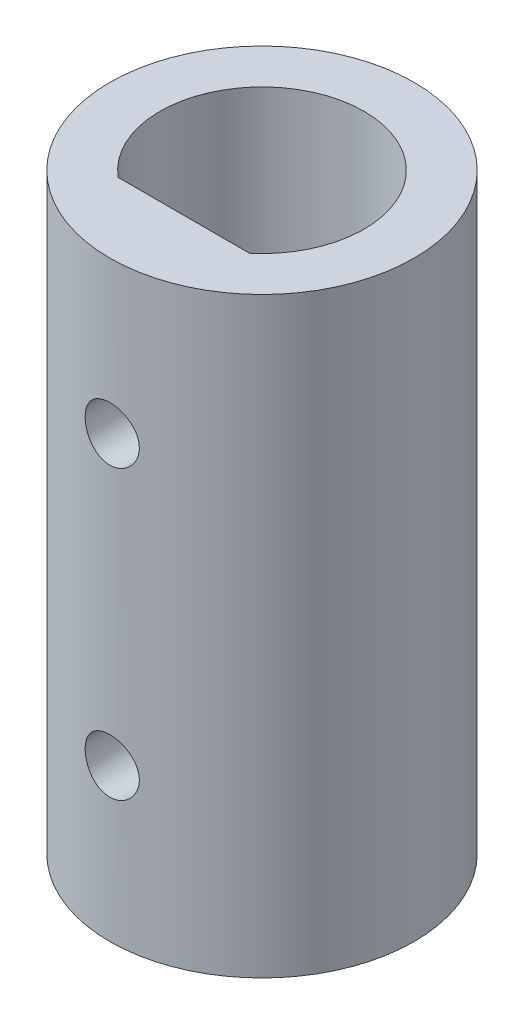
ISO-10303-21;
HEADER;
FILE_DESCRIPTION(('STEP AP214'),'2;1');
FILE_NAME('part.step','',(''),(''),'','','');
FILE_SCHEMA(('AUTOMOTIVE_DESIGN { 1 0 10303 214 1 1 1 1 }'));
ENDSEC;
DATA;
#1=APPLICATION_CONTEXT('core data for automotive mechanical design processes');
#2=APPLICATION_PROTOCOL_DEFINITION('international standard','automotive_design',2000,#1);
#3=PRODUCT_CONTEXT('',#1,'mechanical');
#4=PRODUCT('Part','Part','',(#3));
#5=PRODUCT_RELATED_PRODUCT_CATEGORY('part','',(#4));
#6=PRODUCT_DEFINITION_FORMATION('','',#4);
#7=PRODUCT_DEFINITION_CONTEXT('part definition',#1,'design');
#8=PRODUCT_DEFINITION('design','',#6,#7);
#9=PRODUCT_DEFINITION_SHAPE('','',#8);
#10=(LENGTH_UNIT() NAMED_UNIT(*) SI_UNIT(.MILLI.,.METRE.));
#11=(NAMED_UNIT(*) PLANE_ANGLE_UNIT() SI_UNIT($,.RADIAN.));
#12=(NAMED_UNIT(*) SI_UNIT($,.STERADIAN.) SOLID_ANGLE_UNIT());
#13=UNCERTAINTY_MEASURE_WITH_UNIT(LENGTH_MEASURE(1.E-05),#10,'distance_accuracy_value','');
#14=(GEOMETRIC_REPRESENTATION_CONTEXT(3) GLOBAL_UNCERTAINTY_ASSIGNED_CONTEXT((#13)) GLOBAL_UNIT_ASSIGNED_CONTEXT((#10,
#11,#12)) REPRESENTATION_CONTEXT('',''));
#15=CARTESIAN_POINT('',(0.,0.,0.));
#16=DIRECTION('',(0.,0.,1.));
#17=DIRECTION('',(1.,0.,0.));
#18=AXIS2_PLACEMENT_3D('',#15,#16,#17);
#19=CARTESIAN_POINT('',(0.,24.7,0.));
#20=DIRECTION('',(0.,1.,0.));
#21=DIRECTION('',(0.,0.,1.));
#22=AXIS2_PLACEMENT_3D('',#19,#20,#21);
#23=PLANE('',#22);
#24=CARTESIAN_POINT('',(0.,24.7,0.));
#25=DIRECTION('',(0.,1.,0.));
#26=DIRECTION('',(0.,0.,1.));
#27=AXIS2_PLACEMENT_3D('',#24,#25,#26);
#28=CIRCLE('',#27,6.35);
#29=CARTESIAN_POINT('',(0.,24.7,6.35));
#30=VERTEX_POINT('',#29);
#31=EDGE_CURVE('E11',#30,#30,#28,.T.);
#32=ORIENTED_EDGE('',*,*,#31,.T.);
#33=EDGE_LOOP('',(#32));
#34=FACE_BOUND('',#33,.T.);
#35=DIRECTION('',(1.,0.,0.));
#36=VECTOR('',#35,1.);
#37=CARTESIAN_POINT('',(-2.74238320566813,24.7,3.26033282336529));
#38=LINE('',#37,#36);
#39=CARTESIAN_POINT('',(-2.74238320566813,24.7,3.26033282336529));
#40=VERTEX_POINT('',#39);
#41=CARTESIAN_POINT('',(2.74238320566813,24.7,3.26033282336529));
#42=VERTEX_POINT('',#41);
#43=EDGE_CURVE('E91',#40,#42,#38,.T.);
#44=ORIENTED_EDGE('',*,*,#43,.F.);
#45=CARTESIAN_POINT('',(0.,24.7,0.));
#46=DIRECTION('',(0.,1.,0.));
#47=DIRECTION('',(0.,0.,1.));
#48=AXIS2_PLACEMENT_3D('',#45,#46,#47);
#49=CIRCLE('',#48,4.26033282336529);
#50=EDGE_CURVE('E75',#42,#40,#49,.T.);
#51=ORIENTED_EDGE('',*,*,#50,.F.);
#52=EDGE_LOOP('',(#44,#51));
#53=FACE_BOUND('',#52,.T.);
#54=ADVANCED_FACE('F40',(#34,#53),#23,.T.);
#55=CARTESIAN_POINT('',(0.,0.,0.));
#56=DIRECTION('',(0.,1.,0.));
#57=DIRECTION('',(0.,0.,1.));
#58=AXIS2_PLACEMENT_3D('',#55,#56,#57);
#59=PLANE('',#58);
#60=CARTESIAN_POINT('',(0.,0.,0.));
#61=DIRECTION('',(0.,1.,0.));
#62=DIRECTION('',(0.,0.,1.));
#63=AXIS2_PLACEMENT_3D('',#60,#61,#62);
#64=CIRCLE('',#63,6.35);
#65=CARTESIAN_POINT('',(0.,0.,6.35));
#66=VERTEX_POINT('',#65);
#67=EDGE_CURVE('E45',#66,#66,#64,.T.);
#68=ORIENTED_EDGE('',*,*,#67,.F.);
#69=EDGE_LOOP('',(#68));
#70=FACE_BOUND('',#69,.T.);
#71=CARTESIAN_POINT('',(0.,0.,0.));
#72=DIRECTION('',(0.,1.,0.));
#73=DIRECTION('',(0.,0.,1.));
#74=AXIS2_PLACEMENT_3D('',#71,#72,#73);
#75=CIRCLE('',#74,4.26033282336529);
#76=CARTESIAN_POINT('',(2.74238320566813,0.,3.26033282336529));
#77=VERTEX_POINT('',#76);
#78=CARTESIAN_POINT('',(-2.74238320566813,0.,3.26033282336529));
#79=VERTEX_POINT('',#78);
#80=EDGE_CURVE('E64',#77,#79,#75,.T.);
#81=ORIENTED_EDGE('',*,*,#80,.T.);
#82=DIRECTION('',(1.,0.,0.));
#83=VECTOR('',#82,1.);
#84=CARTESIAN_POINT('',(-2.74238320566813,0.,3.26033282336529));
#85=LINE('',#84,#83);
#86=EDGE_CURVE('E70',#79,#77,#85,.T.);
#87=ORIENTED_EDGE('',*,*,#86,.T.);
#88=EDGE_LOOP('',(#81,#87));
#89=FACE_BOUND('',#88,.T.);
#90=ADVANCED_FACE('F82',(#70,#89),#59,.F.);
#91=CARTESIAN_POINT('',(0.,24.7,0.));
#92=DIRECTION('',(0.,-1.,0.));
#93=DIRECTION('',(0.,0.,-1.));
#94=AXIS2_PLACEMENT_3D('',#91,#92,#93);
#95=CYLINDRICAL_SURFACE('',#94,6.35);
#96=CARTESIAN_POINT('',(0.,17.22,6.35));
#97=CARTESIAN_POINT('',(-0.0629399577008191,17.2200024637697,6.34999888434963));
#98=CARTESIAN_POINT('',(-0.125912656247927,17.2252763142626,6.34905452477746));
#99=CARTESIAN_POINT('',(-0.250087457676584,17.2462210665218,6.34537826804387));
#100=CARTESIAN_POINT('',(-0.311287953507829,17.261901114493,6.34264479842876));
#101=CARTESIAN_POINT('',(-0.430104209618959,17.3031661781344,6.33569648349699));
#102=CARTESIAN_POINT('',(-0.487723014283772,17.3287426445925,6.33148291707934));
#103=CARTESIAN_POINT('',(-0.597845251075668,17.3890511246943,6.32203602195574));
#104=CARTESIAN_POINT('',(-0.65034917682781,17.4237822536416,6.31680279180169));
#105=CARTESIAN_POINT('',(-0.749326542742328,17.501814115411,6.30583196424201));
#106=CARTESIAN_POINT('',(-0.795736518187857,17.5451947379225,6.30008996521651));
#107=CARTESIAN_POINT('',(-0.880659922550115,17.6391222564569,6.28878190547747));
#108=CARTESIAN_POINT('',(-0.919172817680828,17.6896696365109,6.2832158566784));
#109=CARTESIAN_POINT('',(-0.987468276358079,17.7969384519111,6.27284721499309));
#110=CARTESIAN_POINT('',(-1.01718712579184,17.8537010498348,6.2680503039156));
#111=CARTESIAN_POINT('',(-1.06664321936906,17.9715126375646,6.2598246594552));
#112=CARTESIAN_POINT('',(-1.08638123544489,18.0325612954645,6.25639582026793));
#113=CARTESIAN_POINT('',(-1.11511342949689,18.1565358875388,6.2513386355925));
#114=CARTESIAN_POINT('',(-1.12421777540382,18.2194355221677,6.24969184097199));
#115=CARTESIAN_POINT('',(-1.13176596837167,18.3458895064267,6.24832949681279));
#116=CARTESIAN_POINT('',(-1.13021067573572,18.4094438028079,6.24861379142245));
#117=CARTESIAN_POINT('',(-1.11657326235129,18.5346104523972,6.25106468394744));
#118=CARTESIAN_POINT('',(-1.10461569460633,18.5962368762426,6.25320900966246));
#119=CARTESIAN_POINT('',(-1.07070899066206,18.716594677856,6.25910342730552));
#120=CARTESIAN_POINT('',(-1.04875946832941,18.775325943645,6.26285358128956));
#121=CARTESIAN_POINT('',(-0.995368011244417,18.8885946785177,6.27156075796024));
#122=CARTESIAN_POINT('',(-0.963875111111273,18.9431076076952,6.27652423203582));
#123=CARTESIAN_POINT('',(-0.892326975518068,19.0461223228183,6.28709442722226));
#124=CARTESIAN_POINT('',(-0.852270954816918,19.0946235568445,6.29270120730262));
#125=CARTESIAN_POINT('',(-0.764058733569581,19.1849583861128,6.30402370831999));
#126=CARTESIAN_POINT('',(-0.715795840152014,19.226687813058,6.30973984748415));
#127=CARTESIAN_POINT('',(-0.612898694327184,19.3014726924902,6.3205638240554));
#128=CARTESIAN_POINT('',(-0.558264389488849,19.3345280735903,6.32567165645596));
#129=CARTESIAN_POINT('',(-0.444071695660482,19.3910391002486,6.33471231748266));
#130=CARTESIAN_POINT('',(-0.384508223415678,19.4144846835163,6.33864391333014));
#131=CARTESIAN_POINT('',(-0.262203103564915,19.4510093616679,6.34487943237008));
#132=CARTESIAN_POINT('',(-0.199461760195388,19.4640894469143,6.34718351105993));
#133=CARTESIAN_POINT('',(-0.073478858896347,19.479368628902,6.34988324240335));
#134=CARTESIAN_POINT('',(-0.0102551452022524,19.4817105803859,6.35030394870282));
#135=CARTESIAN_POINT('',(0.115680807166263,19.4758291047197,6.34925846225552));
#136=CARTESIAN_POINT('',(0.17839306826035,19.467606143218,6.34779235267011));
#137=CARTESIAN_POINT('',(0.301078429103724,19.4409470635608,6.3431535233318));
#138=CARTESIAN_POINT('',(0.361067567619185,19.4225824942053,6.33999276379296));
#139=CARTESIAN_POINT('',(0.477115542966495,19.3762383826707,6.33231756519775));
#140=CARTESIAN_POINT('',(0.533174133877712,19.348258239524,6.32780304153415));
#141=CARTESIAN_POINT('',(0.640384525168203,19.2831558696105,6.31785868215815));
#142=CARTESIAN_POINT('',(0.691481941351823,19.2459454325524,6.31242018443781));
#143=CARTESIAN_POINT('',(0.786758391627041,19.1635590330923,6.30125515306999));
#144=CARTESIAN_POINT('',(0.830936847372642,19.1183824054782,6.29552859539679));
#145=CARTESIAN_POINT('',(0.911657891901744,19.0207020682917,6.28435073267801));
#146=CARTESIAN_POINT('',(0.94810343817564,18.9681176217865,6.27890351026718));
#147=CARTESIAN_POINT('',(1.01164397617943,18.857488913359,6.26898037808471));
#148=CARTESIAN_POINT('',(1.03873929277566,18.7994448412162,6.26450443456875));
#149=CARTESIAN_POINT('',(1.08266905763519,18.6798026798861,6.25706202453356));
#150=CARTESIAN_POINT('',(1.09954978675862,18.6182220262732,6.25408875984629));
#151=CARTESIAN_POINT('',(1.12271538156272,18.4930412979424,6.2499720818292));
#152=CARTESIAN_POINT('',(1.12900131160193,18.4294414267301,6.2488284846907));
#153=CARTESIAN_POINT('',(1.13076603971789,18.302998195127,6.24850929319388));
#154=CARTESIAN_POINT('',(1.12639774759767,18.2401569875695,6.24930585339935));
#155=CARTESIAN_POINT('',(1.10731085189081,18.1161194424305,6.25271581916397));
#156=CARTESIAN_POINT('',(1.0925922961175,18.0549230972519,6.25532921633018));
#157=CARTESIAN_POINT('',(1.05328443387377,17.9359837727612,6.26206720107938));
#158=CARTESIAN_POINT('',(1.02871008961607,17.8782357105489,6.26618949715672));
#159=CARTESIAN_POINT('',(0.970404434971474,17.7676575027985,6.27548268489756));
#160=CARTESIAN_POINT('',(0.936672567531126,17.7148276566989,6.28065364034631));
#161=CARTESIAN_POINT('',(0.860471089982826,17.6148164095938,6.29154882500414));
#162=CARTESIAN_POINT('',(0.817889609705644,17.5677209435172,6.29727958408207));
#163=CARTESIAN_POINT('',(0.725432295520826,17.4812922312998,6.30859831056718));
#164=CARTESIAN_POINT('',(0.675554785842124,17.4419607733058,6.31418624482268));
#165=CARTESIAN_POINT('',(0.569445223963215,17.3718856685687,6.32464183033691));
#166=CARTESIAN_POINT('',(0.513165573498392,17.3412131653736,6.32950336839369));
#167=CARTESIAN_POINT('',(0.396186039696229,17.2898064926686,6.33789887797285));
#168=CARTESIAN_POINT('',(0.335490492911398,17.2690627206178,6.34143413148865));
#169=CARTESIAN_POINT('',(0.228823740973171,17.2424523318581,6.34603388241872));
#170=CARTESIAN_POINT('',(0.183486832522365,17.234046663634,6.34751299148448));
#171=CARTESIAN_POINT('',(0.0921057844594946,17.2228196556706,6.34949644812483));
#172=CARTESIAN_POINT('',(0.0460616599398405,17.2199981969273,6.35000081647192));
#173=CARTESIAN_POINT('',(0.,17.22,6.35));
#174=B_SPLINE_CURVE_WITH_KNOTS('',3,(#96,#97,#98,#99,#100,#101,#102,#103,#104,#105,#106,#107,
#108,#109,#110,#111,#112,#113,#114,#115,#116,#117,#118,#119,#120,#121,#122,#123,#124,#125,#126,
#127,#128,#129,#130,#131,#132,#133,#134,#135,#136,#137,#138,#139,#140,#141,#142,#143,#144,#145,
#146,#147,#148,#149,#150,#151,#152,#153,#154,#155,#156,#157,#158,#159,#160,#161,#162,#163,#164,
#165,#166,#167,#168,#169,#170,#171,#172,#173),.UNSPECIFIED.,.T.,.F.,(4,2,2,2,2,2,2,2,2,2,2,2,2,
2,2,2,2,2,2,2,2,2,2,2,2,2,2,2,2,2,2,2,2,2,2,2,2,2,4),(0.,0.188651461907671,0.377468953151042,
0.566123693618805,0.754760209382763,0.945227273032747,1.13570720665005,1.32753518070258,
1.51934831622696,1.70915607127828,1.89894850777233,2.08649923979312,2.27405722021965,
2.46263503412746,2.6512301481088,2.84249646693217,3.03376435981897,3.22523201825415,
3.41668138087569,3.60557626311063,3.7944628200937,3.98203350315197,4.16961591139971,
4.35906512869483,4.54853017333657,4.74024809805132,4.93195936100736,5.12279537318303,
5.31361221273967,5.50170659778937,5.68980011393742,5.87760915701834,6.06542962711112,
6.25578707201862,6.44618830757179,6.63811117978734,6.82984805744879,6.96791273037186,
7.10597446099535),.UNSPECIFIED.);
#175=CARTESIAN_POINT('',(0.,17.22,6.35));
#176=VERTEX_POINT('',#175);
#177=EDGE_CURVE('E84',#176,#176,#174,.T.);
#178=ORIENTED_EDGE('',*,*,#177,.T.);
#179=EDGE_LOOP('',(#178));
#180=FACE_BOUND('',#179,.T.);
#181=CARTESIAN_POINT('',(0.,5.22,6.35));
#182=CARTESIAN_POINT('',(-0.062939957700819,5.22000246376968,6.34999888434963));
#183=CARTESIAN_POINT('',(-0.125912656247927,5.22527631426258,6.34905452477746));
#184=CARTESIAN_POINT('',(-0.250087457676584,5.24622106652184,6.34537826804387));
#185=CARTESIAN_POINT('',(-0.311287953507829,5.26190111449296,6.34264479842876));
#186=CARTESIAN_POINT('',(-0.430104209618959,5.30316617813443,6.33569648349699));
#187=CARTESIAN_POINT('',(-0.487723014283772,5.3287426445925,6.33148291707934));
#188=CARTESIAN_POINT('',(-0.597845251075668,5.38905112469426,6.32203602195574));
#189=CARTESIAN_POINT('',(-0.65034917682781,5.42378225364158,6.31680279180169));
#190=CARTESIAN_POINT('',(-0.749326542742328,5.50181411541102,6.30583196424201));
#191=CARTESIAN_POINT('',(-0.795736518187857,5.54519473792252,6.30008996521651));
#192=CARTESIAN_POINT('',(-0.880659922550115,5.63912225645694,6.28878190547747));
#193=CARTESIAN_POINT('',(-0.919172817680828,5.68966963651094,6.2832158566784));
#194=CARTESIAN_POINT('',(-0.987468276358079,5.79693845191112,6.27284721499309));
#195=CARTESIAN_POINT('',(-1.01718712579184,5.85370104983483,6.2680503039156));
#196=CARTESIAN_POINT('',(-1.06664321936906,5.97151263756463,6.2598246594552));
#197=CARTESIAN_POINT('',(-1.08638123544489,6.0325612954645,6.25639582026793));
#198=CARTESIAN_POINT('',(-1.11511342949689,6.15653588753875,6.2513386355925));
#199=CARTESIAN_POINT('',(-1.12421777540382,6.21943552216768,6.24969184097199));
#200=CARTESIAN_POINT('',(-1.13176596837167,6.34588950642672,6.24832949681279));
#201=CARTESIAN_POINT('',(-1.13021067573572,6.40944380280794,6.24861379142245));
#202=CARTESIAN_POINT('',(-1.11657326235129,6.53461045239715,6.25106468394744));
#203=CARTESIAN_POINT('',(-1.10461569460633,6.5962368762426,6.25320900966246));
#204=CARTESIAN_POINT('',(-1.07070899066206,6.71659467785598,6.25910342730552));
#205=CARTESIAN_POINT('',(-1.04875946832941,6.77532594364497,6.26285358128956));
#206=CARTESIAN_POINT('',(-0.995368011244416,6.88859467851765,6.27156075796024));
#207=CARTESIAN_POINT('',(-0.963875111111272,6.94310760769521,6.27652423203582));
#208=CARTESIAN_POINT('',(-0.892326975518066,7.04612232281828,6.28709442722226));
#209=CARTESIAN_POINT('',(-0.852270954816915,7.09462355684448,6.29270120730262));
#210=CARTESIAN_POINT('',(-0.764058733569577,7.18495838611279,6.30402370831999));
#211=CARTESIAN_POINT('',(-0.71579584015201,7.22668781305796,6.30973984748415));
#212=CARTESIAN_POINT('',(-0.612898694327181,7.3014726924902,6.3205638240554));
#213=CARTESIAN_POINT('',(-0.558264389488847,7.33452807359027,6.32567165645596));
#214=CARTESIAN_POINT('',(-0.44407169566048,7.39103910024864,6.33471231748266));
#215=CARTESIAN_POINT('',(-0.384508223415676,7.41448468351626,6.33864391333014));
#216=CARTESIAN_POINT('',(-0.262203103564913,7.45100936166793,6.34487943237008));
#217=CARTESIAN_POINT('',(-0.199461760195385,7.46408944691429,6.34718351105993));
#218=CARTESIAN_POINT('',(-0.0734788588963444,7.47936862890195,6.34988324240335));
#219=CARTESIAN_POINT('',(-0.0102551452022497,7.48171058038584,6.35030394870282));
#220=CARTESIAN_POINT('',(0.115680807166266,7.47582910471972,6.34925846225552));
#221=CARTESIAN_POINT('',(0.178393068260352,7.46760614321799,6.34779235267011));
#222=CARTESIAN_POINT('',(0.301078429103726,7.44094706356084,6.3431535233318));
#223=CARTESIAN_POINT('',(0.361067567619187,7.42258249420531,6.33999276379296));
#224=CARTESIAN_POINT('',(0.477115542966497,7.37623838267074,6.33231756519775));
#225=CARTESIAN_POINT('',(0.533174133877714,7.34825823952401,6.32780304153415));
#226=CARTESIAN_POINT('',(0.640384525168205,7.28315586961047,6.31785868215815));
#227=CARTESIAN_POINT('',(0.691481941351824,7.24594543255239,6.31242018443781));
#228=CARTESIAN_POINT('',(0.786758391627042,7.16355903309232,6.30125515306999));
#229=CARTESIAN_POINT('',(0.830936847372643,7.11838240547814,6.29552859539679));
#230=CARTESIAN_POINT('',(0.911657891901744,7.02070206829171,6.28435073267801));
#231=CARTESIAN_POINT('',(0.94810343817564,6.96811762178654,6.27890351026718));
#232=CARTESIAN_POINT('',(1.01164397617943,6.85748891335899,6.26898037808471));
#233=CARTESIAN_POINT('',(1.03873929277567,6.79944484121617,6.26450443456875));
#234=CARTESIAN_POINT('',(1.08266905763519,6.67980267988611,6.25706202453356));
#235=CARTESIAN_POINT('',(1.09954978675862,6.61822202627323,6.25408875984629));
#236=CARTESIAN_POINT('',(1.12271538156272,6.49304129794239,6.2499720818292));
#237=CARTESIAN_POINT('',(1.12900131160193,6.4294414267301,6.2488284846907));
#238=CARTESIAN_POINT('',(1.13076603971789,6.30299819512699,6.24850929319388));
#239=CARTESIAN_POINT('',(1.12639774759767,6.24015698756952,6.24930585339935));
#240=CARTESIAN_POINT('',(1.1073108518908,6.11611944243051,6.25271581916397));
#241=CARTESIAN_POINT('',(1.0925922961175,6.05492309725184,6.25532921633018));
#242=CARTESIAN_POINT('',(1.05328443387377,5.9359837727612,6.26206720107938));
#243=CARTESIAN_POINT('',(1.02871008961607,5.87823571054885,6.26618949715672));
#244=CARTESIAN_POINT('',(0.970404434971472,5.76765750279847,6.27548268489756));
#245=CARTESIAN_POINT('',(0.936672567531124,5.71482765669886,6.28065364034631));
#246=CARTESIAN_POINT('',(0.860471089982822,5.61481640959377,6.29154882500414));
#247=CARTESIAN_POINT('',(0.81788960970564,5.56772094351718,6.29727958408207));
#248=CARTESIAN_POINT('',(0.725432295520822,5.48129223129981,6.30859831056718));
#249=CARTESIAN_POINT('',(0.675554785842121,5.44196077330582,6.31418624482268));
#250=CARTESIAN_POINT('',(0.569445223963213,5.37188566856867,6.32464183033691));
#251=CARTESIAN_POINT('',(0.513165573498389,5.34121316537356,6.32950336839369));
#252=CARTESIAN_POINT('',(0.396186039696226,5.28980649266859,6.33789887797285));
#253=CARTESIAN_POINT('',(0.335490492911395,5.26906272061776,6.34143413148865));
#254=CARTESIAN_POINT('',(0.228823740973169,5.24245233185805,6.34603388241872));
#255=CARTESIAN_POINT('',(0.183486832522363,5.23404666363404,6.34751299148448));
#256=CARTESIAN_POINT('',(0.0921057844594933,5.22281965567062,6.34949644812483));
#257=CARTESIAN_POINT('',(0.0460616599398398,5.21999819692727,6.35000081647192));
#258=CARTESIAN_POINT('',(0.,5.22,6.35));
#259=B_SPLINE_CURVE_WITH_KNOTS('',3,(#181,#182,#183,#184,#185,#186,#187,#188,#189,#190,#191,
#192,#193,#194,#195,#196,#197,#198,#199,#200,#201,#202,#203,#204,#205,#206,#207,#208,#209,#210,
#211,#212,#213,#214,#215,#216,#217,#218,#219,#220,#221,#222,#223,#224,#225,#226,#227,#228,#229,
#230,#231,#232,#233,#234,#235,#236,#237,#238,#239,#240,#241,#242,#243,#244,#245,#246,#247,#248,
#249,#250,#251,#252,#253,#254,#255,#256,#257,#258),.UNSPECIFIED.,.T.,.F.,(4,2,2,2,2,2,2,2,2,2,2,
2,2,2,2,2,2,2,2,2,2,2,2,2,2,2,2,2,2,2,2,2,2,2,2,2,2,2,4),(0.,0.188651461907671,
0.377468953151042,0.566123693618804,0.754760209382762,0.945227273032746,1.13570720665005,
1.32753518070258,1.51934831622696,1.70915607127829,1.89894850777233,2.08649923979312,
2.27405722021965,2.46263503412747,2.6512301481088,2.84249646693217,3.03376435981897,
3.22523201825415,3.41668138087569,3.60557626311063,3.7944628200937,3.98203350315197,
4.16961591139972,4.35906512869483,4.54853017333657,4.74024809805132,4.93195936100737,
5.12279537318304,5.31361221273967,5.50170659778937,5.68980011393742,5.87760915701834,
6.06542962711113,6.25578707201862,6.4461883075718,6.63811117978734,6.82984805744879,
6.96791273037186,7.10597446099535),.UNSPECIFIED.);
#260=CARTESIAN_POINT('',(0.,5.22,6.35));
#261=VERTEX_POINT('',#260);
#262=EDGE_CURVE('E88',#261,#261,#259,.T.);
#263=ORIENTED_EDGE('',*,*,#262,.T.);
#264=EDGE_LOOP('',(#263));
#265=FACE_BOUND('',#264,.T.);
#266=ORIENTED_EDGE('',*,*,#31,.F.);
#267=EDGE_LOOP('',(#266));
#268=FACE_BOUND('',#267,.T.);
#269=ORIENTED_EDGE('',*,*,#67,.T.);
#270=EDGE_LOOP('',(#269));
#271=FACE_BOUND('',#270,.T.);
#272=ADVANCED_FACE('F42',(#180,#265,#268,#271),#95,.T.);
#273=CARTESIAN_POINT('',(0.,24.7,0.));
#274=DIRECTION('',(0.,-1.,0.));
#275=DIRECTION('',(0.,0.,-1.));
#276=AXIS2_PLACEMENT_3D('',#273,#274,#275);
#277=CYLINDRICAL_SURFACE('',#276,4.26033282336529);
#278=ORIENTED_EDGE('',*,*,#80,.F.);
#279=DIRECTION('',(0.,-1.,0.));
#280=VECTOR('',#279,1.);
#281=CARTESIAN_POINT('',(2.74238320566813,24.7,3.26033282336529));
#282=LINE('',#281,#280);
#283=EDGE_CURVE('E72',#42,#77,#282,.T.);
#284=ORIENTED_EDGE('',*,*,#283,.F.);
#285=ORIENTED_EDGE('',*,*,#50,.T.);
#286=DIRECTION('',(0.,-1.,0.));
#287=VECTOR('',#286,1.);
#288=CARTESIAN_POINT('',(-2.74238320566813,24.7,3.26033282336529));
#289=LINE('',#288,#287);
#290=EDGE_CURVE('E57',#40,#79,#289,.T.);
#291=ORIENTED_EDGE('',*,*,#290,.T.);
#292=EDGE_LOOP('',(#278,#284,#285,#291));
#293=FACE_BOUND('',#292,.T.);
#294=ADVANCED_FACE('F77',(#293),#277,.F.);
#295=CARTESIAN_POINT('',(-2.74238320566813,24.7,3.26033282336529));
#296=DIRECTION('',(0.,0.,-1.));
#297=DIRECTION('',(-1.,0.,0.));
#298=AXIS2_PLACEMENT_3D('',#295,#296,#297);
#299=PLANE('',#298);
#300=CARTESIAN_POINT('',(0.,18.35,3.26033282336529));
#301=DIRECTION('',(0.,0.,-1.));
#302=DIRECTION('',(-1.,0.,0.));
#303=AXIS2_PLACEMENT_3D('',#300,#301,#302);
#304=CIRCLE('',#303,1.13);
#305=CARTESIAN_POINT('',(-1.13,18.35,3.26033282336529));
#306=VERTEX_POINT('',#305);
#307=EDGE_CURVE('E144',#306,#306,#304,.T.);
#308=ORIENTED_EDGE('',*,*,#307,.F.);
#309=EDGE_LOOP('',(#308));
#310=FACE_BOUND('',#309,.T.);
#311=CARTESIAN_POINT('',(0.,6.35,3.26033282336529));
#312=DIRECTION('',(0.,0.,-1.));
#313=DIRECTION('',(1.,0.,0.));
#314=AXIS2_PLACEMENT_3D('',#311,#312,#313);
#315=CIRCLE('',#314,1.13);
#316=CARTESIAN_POINT('',(1.13,6.35,3.26033282336529));
#317=VERTEX_POINT('',#316);
#318=EDGE_CURVE('E147',#317,#317,#315,.T.);
#319=ORIENTED_EDGE('',*,*,#318,.F.);
#320=EDGE_LOOP('',(#319));
#321=FACE_BOUND('',#320,.T.);
#322=ORIENTED_EDGE('',*,*,#86,.F.);
#323=ORIENTED_EDGE('',*,*,#290,.F.);
#324=ORIENTED_EDGE('',*,*,#43,.T.);
#325=ORIENTED_EDGE('',*,*,#283,.T.);
#326=EDGE_LOOP('',(#322,#323,#324,#325));
#327=FACE_BOUND('',#326,.T.);
#328=ADVANCED_FACE('F71',(#310,#321,#327),#299,.T.);
#329=CARTESIAN_POINT('',(0.,6.35,6.35));
#330=DIRECTION('',(0.,0.,-1.));
#331=DIRECTION('',(-1.,0.,0.));
#332=AXIS2_PLACEMENT_3D('',#329,#330,#331);
#333=CYLINDRICAL_SURFACE('',#332,1.13);
#334=ORIENTED_EDGE('',*,*,#318,.T.);
#335=EDGE_LOOP('',(#334));
#336=FACE_BOUND('',#335,.T.);
#337=ORIENTED_EDGE('',*,*,#262,.F.);
#338=EDGE_LOOP('',(#337));
#339=FACE_BOUND('',#338,.T.);
#340=ADVANCED_FACE('F110',(#336,#339),#333,.F.);
#341=CARTESIAN_POINT('',(0.,18.35,6.35));
#342=DIRECTION('',(0.,0.,-1.));
#343=DIRECTION('',(-1.,0.,0.));
#344=AXIS2_PLACEMENT_3D('',#341,#342,#343);
#345=CYLINDRICAL_SURFACE('',#344,1.13);
#346=ORIENTED_EDGE('',*,*,#307,.T.);
#347=EDGE_LOOP('',(#346));
#348=FACE_BOUND('',#347,.T.);
#349=ORIENTED_EDGE('',*,*,#177,.F.);
#350=EDGE_LOOP('',(#349));
#351=FACE_BOUND('',#350,.T.);
#352=ADVANCED_FACE('F107',(#348,#351),#345,.F.);
#353=CLOSED_SHELL('',(#54,#90,#272,#294,#328,#340,#352));
#354=MANIFOLD_SOLID_BREP('B2',#353);
#355=ADVANCED_BREP_SHAPE_REPRESENTATION('',(#18,#354),#14);
#356=SHAPE_DEFINITION_REPRESENTATION(#9,#355);
ENDSEC;
END-ISO-10303-21;
